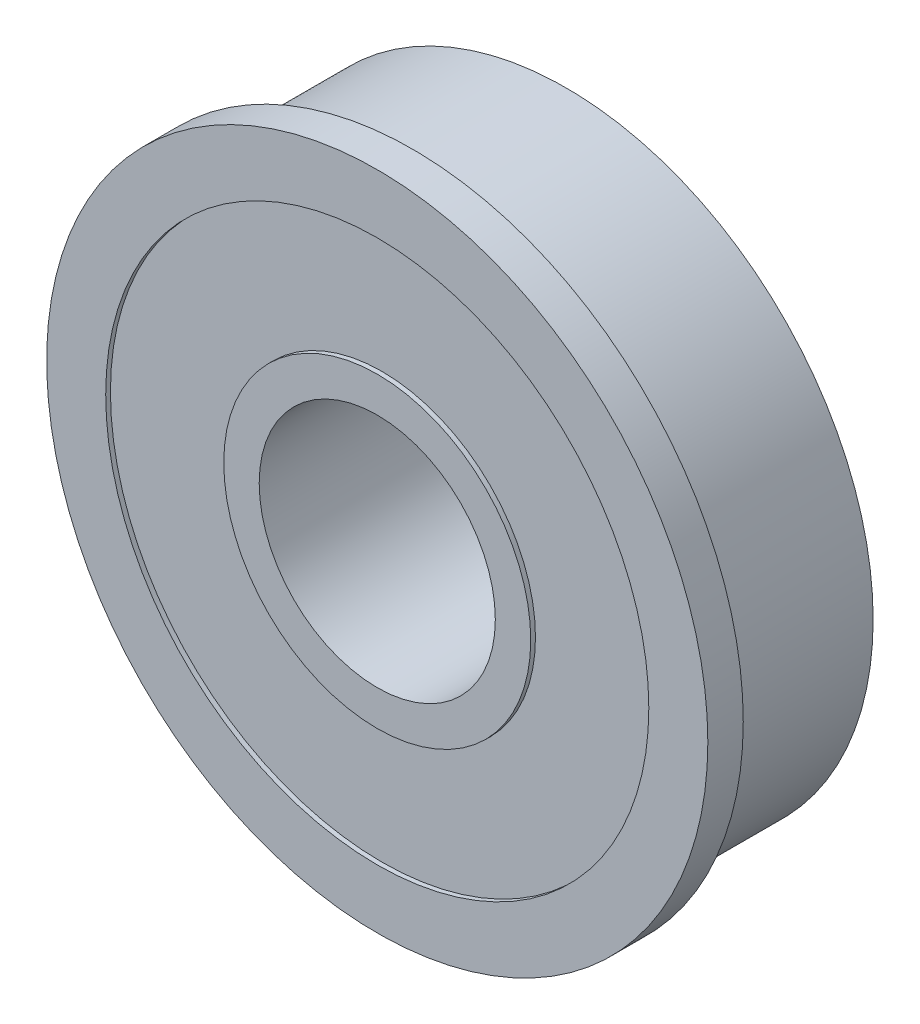
ISO-10303-21;
HEADER;
FILE_DESCRIPTION(('STEP AP214'),'2;1');
FILE_NAME('part.step','',(''),(''),'','','');
FILE_SCHEMA(('AUTOMOTIVE_DESIGN { 1 0 10303 214 1 1 1 1 }'));
ENDSEC;
DATA;
#1=APPLICATION_CONTEXT('core data for automotive mechanical design processes');
#2=APPLICATION_PROTOCOL_DEFINITION('international standard','automotive_design',2000,#1);
#3=PRODUCT_CONTEXT('',#1,'mechanical');
#4=PRODUCT('Part','Part','',(#3));
#5=PRODUCT_RELATED_PRODUCT_CATEGORY('part','',(#4));
#6=PRODUCT_DEFINITION_FORMATION('','',#4);
#7=PRODUCT_DEFINITION_CONTEXT('part definition',#1,'design');
#8=PRODUCT_DEFINITION('design','',#6,#7);
#9=PRODUCT_DEFINITION_SHAPE('','',#8);
#10=(LENGTH_UNIT() NAMED_UNIT(*) SI_UNIT(.MILLI.,.METRE.));
#11=(NAMED_UNIT(*) PLANE_ANGLE_UNIT() SI_UNIT($,.RADIAN.));
#12=(NAMED_UNIT(*) SI_UNIT($,.STERADIAN.) SOLID_ANGLE_UNIT());
#13=UNCERTAINTY_MEASURE_WITH_UNIT(LENGTH_MEASURE(1.E-05),#10,'distance_accuracy_value','');
#14=(GEOMETRIC_REPRESENTATION_CONTEXT(3) GLOBAL_UNCERTAINTY_ASSIGNED_CONTEXT((#13)) GLOBAL_UNIT_ASSIGNED_CONTEXT((#10,
#11,#12)) REPRESENTATION_CONTEXT('',''));
#15=CARTESIAN_POINT('',(0.,0.,0.));
#16=DIRECTION('',(0.,0.,1.));
#17=DIRECTION('',(1.,0.,0.));
#18=AXIS2_PLACEMENT_3D('',#15,#16,#17);
#19=CARTESIAN_POINT('',(0.,0.,0.));
#20=DIRECTION('',(0.,0.,1.));
#21=DIRECTION('',(1.,0.,0.));
#22=AXIS2_PLACEMENT_3D('',#19,#20,#21);
#23=PLANE('',#22);
#24=CARTESIAN_POINT('',(0.,0.,0.));
#25=DIRECTION('',(0.,0.,-1.));
#26=DIRECTION('',(-1.,0.,0.));
#27=AXIS2_PLACEMENT_3D('',#24,#25,#26);
#28=CIRCLE('',#27,5.);
#29=CARTESIAN_POINT('',(-5.,0.,0.));
#30=VERTEX_POINT('',#29);
#31=EDGE_CURVE('E64',#30,#30,#28,.F.);
#32=ORIENTED_EDGE('',*,*,#31,.T.);
#33=EDGE_LOOP('',(#32));
#34=FACE_BOUND('',#33,.T.);
#35=CARTESIAN_POINT('',(0.,0.,0.));
#36=DIRECTION('',(0.,0.,-1.));
#37=DIRECTION('',(-1.,0.,0.));
#38=AXIS2_PLACEMENT_3D('',#35,#36,#37);
#39=CIRCLE('',#38,6.5);
#40=CARTESIAN_POINT('',(-6.5,0.,0.));
#41=VERTEX_POINT('',#40);
#42=EDGE_CURVE('E101',#41,#41,#39,.T.);
#43=ORIENTED_EDGE('',*,*,#42,.T.);
#44=EDGE_LOOP('',(#43));
#45=FACE_BOUND('',#44,.T.);
#46=ADVANCED_FACE('F40',(#34,#45),#23,.F.);
#47=CARTESIAN_POINT('',(0.,0.,8.));
#48=DIRECTION('',(0.,0.,1.));
#49=DIRECTION('',(1.,0.,0.));
#50=AXIS2_PLACEMENT_3D('',#47,#48,#49);
#51=PLANE('',#50);
#52=CARTESIAN_POINT('',(0.,0.,8.));
#53=DIRECTION('',(0.,0.,-1.));
#54=DIRECTION('',(-1.,0.,0.));
#55=AXIS2_PLACEMENT_3D('',#52,#53,#54);
#56=CIRCLE('',#55,5.);
#57=CARTESIAN_POINT('',(-5.,0.,8.));
#58=VERTEX_POINT('',#57);
#59=EDGE_CURVE('E49',#58,#58,#56,.T.);
#60=ORIENTED_EDGE('',*,*,#59,.T.);
#61=EDGE_LOOP('',(#60));
#62=FACE_BOUND('',#61,.T.);
#63=CARTESIAN_POINT('',(0.,0.,8.));
#64=DIRECTION('',(0.,0.,1.));
#65=DIRECTION('',(1.,0.,0.));
#66=AXIS2_PLACEMENT_3D('',#63,#64,#65);
#67=CIRCLE('',#66,6.5);
#68=CARTESIAN_POINT('',(6.5,0.,8.));
#69=VERTEX_POINT('',#68);
#70=EDGE_CURVE('E85',#69,#69,#67,.T.);
#71=ORIENTED_EDGE('',*,*,#70,.T.);
#72=EDGE_LOOP('',(#71));
#73=FACE_BOUND('',#72,.T.);
#74=ADVANCED_FACE('F138',(#62,#73),#51,.T.);
#75=CARTESIAN_POINT('',(0.,0.,8.));
#76=DIRECTION('',(0.,0.,-1.));
#77=DIRECTION('',(-1.,0.,0.));
#78=AXIS2_PLACEMENT_3D('',#75,#76,#77);
#79=CYLINDRICAL_SURFACE('',#78,13.);
#80=CARTESIAN_POINT('',(0.,0.,6.5));
#81=DIRECTION('',(0.,0.,-1.));
#82=DIRECTION('',(-1.,0.,0.));
#83=AXIS2_PLACEMENT_3D('',#80,#81,#82);
#84=CIRCLE('',#83,13.);
#85=CARTESIAN_POINT('',(-13.,0.,6.5));
#86=VERTEX_POINT('',#85);
#87=EDGE_CURVE('E67',#86,#86,#84,.T.);
#88=ORIENTED_EDGE('',*,*,#87,.T.);
#89=EDGE_LOOP('',(#88));
#90=FACE_BOUND('',#89,.T.);
#91=CARTESIAN_POINT('',(0.,0.,0.));
#92=DIRECTION('',(0.,0.,-1.));
#93=DIRECTION('',(-1.,0.,0.));
#94=AXIS2_PLACEMENT_3D('',#91,#92,#93);
#95=CIRCLE('',#94,13.);
#96=CARTESIAN_POINT('',(-13.,0.,0.));
#97=VERTEX_POINT('',#96);
#98=EDGE_CURVE('E44',#97,#97,#95,.F.);
#99=ORIENTED_EDGE('',*,*,#98,.T.);
#100=EDGE_LOOP('',(#99));
#101=FACE_BOUND('',#100,.T.);
#102=ADVANCED_FACE('F42',(#90,#101),#79,.T.);
#103=CARTESIAN_POINT('',(0.,0.120654378241259,0.));
#104=DIRECTION('',(0.,0.,-1.));
#105=DIRECTION('',(-1.,0.,0.));
#106=AXIS2_PLACEMENT_3D('',#103,#104,#105);
#107=CIRCLE('',#106,11.5);
#108=CARTESIAN_POINT('',(-11.5,0.120654378241259,0.));
#109=VERTEX_POINT('',#108);
#110=EDGE_CURVE('E93',#109,#109,#107,.T.);
#111=ORIENTED_EDGE('',*,*,#110,.F.);
#112=EDGE_LOOP('',(#111));
#113=FACE_BOUND('',#112,.T.);
#114=ORIENTED_EDGE('',*,*,#98,.F.);
#115=EDGE_LOOP('',(#114));
#116=FACE_BOUND('',#115,.T.);
#117=ADVANCED_FACE('F125',(#113,#116),#23,.F.);
#118=CARTESIAN_POINT('',(0.,0.,6.5));
#119=DIRECTION('',(0.,0.,1.));
#120=DIRECTION('',(1.,0.,0.));
#121=AXIS2_PLACEMENT_3D('',#118,#119,#120);
#122=PLANE('',#121);
#123=ORIENTED_EDGE('',*,*,#87,.F.);
#124=EDGE_LOOP('',(#123));
#125=FACE_BOUND('',#124,.T.);
#126=CARTESIAN_POINT('',(0.,0.,6.5));
#127=DIRECTION('',(0.,0.,1.));
#128=DIRECTION('',(1.,0.,0.));
#129=AXIS2_PLACEMENT_3D('',#126,#127,#128);
#130=CIRCLE('',#129,14.);
#131=CARTESIAN_POINT('',(14.,0.,6.5));
#132=VERTEX_POINT('',#131);
#133=EDGE_CURVE('E55',#132,#132,#130,.T.);
#134=ORIENTED_EDGE('',*,*,#133,.F.);
#135=EDGE_LOOP('',(#134));
#136=FACE_BOUND('',#135,.T.);
#137=ADVANCED_FACE('F128',(#125,#136),#122,.F.);
#138=CARTESIAN_POINT('',(0.,0.,8.));
#139=DIRECTION('',(0.,0.,-1.));
#140=DIRECTION('',(-1.,0.,0.));
#141=AXIS2_PLACEMENT_3D('',#138,#139,#140);
#142=CYLINDRICAL_SURFACE('',#141,5.);
#143=ORIENTED_EDGE('',*,*,#59,.F.);
#144=EDGE_LOOP('',(#143));
#145=FACE_BOUND('',#144,.T.);
#146=ORIENTED_EDGE('',*,*,#31,.F.);
#147=EDGE_LOOP('',(#146));
#148=FACE_BOUND('',#147,.T.);
#149=ADVANCED_FACE('F134',(#145,#148),#142,.F.);
#150=CARTESIAN_POINT('',(0.,0.,6.5));
#151=DIRECTION('',(0.,0.,1.));
#152=DIRECTION('',(1.,0.,0.));
#153=AXIS2_PLACEMENT_3D('',#150,#151,#152);
#154=CYLINDRICAL_SURFACE('',#153,14.);
#155=ORIENTED_EDGE('',*,*,#133,.T.);
#156=EDGE_LOOP('',(#155));
#157=FACE_BOUND('',#156,.T.);
#158=CARTESIAN_POINT('',(0.,0.,8.));
#159=DIRECTION('',(0.,0.,1.));
#160=DIRECTION('',(1.,0.,0.));
#161=AXIS2_PLACEMENT_3D('',#158,#159,#160);
#162=CIRCLE('',#161,14.);
#163=CARTESIAN_POINT('',(14.,0.,8.));
#164=VERTEX_POINT('',#163);
#165=EDGE_CURVE('E10',#164,#164,#162,.T.);
#166=ORIENTED_EDGE('',*,*,#165,.F.);
#167=EDGE_LOOP('',(#166));
#168=FACE_BOUND('',#167,.T.);
#169=ADVANCED_FACE('F167',(#157,#168),#154,.T.);
#170=CARTESIAN_POINT('',(0.,0.,8.));
#171=DIRECTION('',(0.,0.,1.));
#172=DIRECTION('',(1.,0.,0.));
#173=AXIS2_PLACEMENT_3D('',#170,#171,#172);
#174=CIRCLE('',#173,11.5);
#175=CARTESIAN_POINT('',(11.5,0.,8.));
#176=VERTEX_POINT('',#175);
#177=EDGE_CURVE('E58',#176,#176,#174,.T.);
#178=ORIENTED_EDGE('',*,*,#177,.F.);
#179=EDGE_LOOP('',(#178));
#180=FACE_BOUND('',#179,.T.);
#181=ORIENTED_EDGE('',*,*,#165,.T.);
#182=EDGE_LOOP('',(#181));
#183=FACE_BOUND('',#182,.T.);
#184=ADVANCED_FACE('F147',(#180,#183),#51,.T.);
#185=CARTESIAN_POINT('',(0.,0.,7.8));
#186=DIRECTION('',(0.,0.,1.));
#187=DIRECTION('',(1.,0.,0.));
#188=AXIS2_PLACEMENT_3D('',#185,#186,#187);
#189=CYLINDRICAL_SURFACE('',#188,11.5);
#190=CARTESIAN_POINT('',(0.,0.,7.8));
#191=DIRECTION('',(0.,0.,1.));
#192=DIRECTION('',(1.,0.,0.));
#193=AXIS2_PLACEMENT_3D('',#190,#191,#192);
#194=CIRCLE('',#193,11.5);
#195=CARTESIAN_POINT('',(11.5,0.,7.8));
#196=VERTEX_POINT('',#195);
#197=EDGE_CURVE('E74',#196,#196,#194,.T.);
#198=ORIENTED_EDGE('',*,*,#197,.F.);
#199=EDGE_LOOP('',(#198));
#200=FACE_BOUND('',#199,.T.);
#201=ORIENTED_EDGE('',*,*,#177,.T.);
#202=EDGE_LOOP('',(#201));
#203=FACE_BOUND('',#202,.T.);
#204=ADVANCED_FACE('F139',(#200,#203),#189,.F.);
#205=CARTESIAN_POINT('',(0.,0.,7.8));
#206=DIRECTION('',(0.,0.,1.));
#207=DIRECTION('',(1.,0.,0.));
#208=AXIS2_PLACEMENT_3D('',#205,#206,#207);
#209=PLANE('',#208);
#210=CARTESIAN_POINT('',(0.,0.,7.8));
#211=DIRECTION('',(0.,0.,1.));
#212=DIRECTION('',(1.,0.,0.));
#213=AXIS2_PLACEMENT_3D('',#210,#211,#212);
#214=CIRCLE('',#213,6.5);
#215=CARTESIAN_POINT('',(6.5,0.,7.8));
#216=VERTEX_POINT('',#215);
#217=EDGE_CURVE('E83',#216,#216,#214,.T.);
#218=ORIENTED_EDGE('',*,*,#217,.F.);
#219=EDGE_LOOP('',(#218));
#220=FACE_BOUND('',#219,.T.);
#221=ORIENTED_EDGE('',*,*,#197,.T.);
#222=EDGE_LOOP('',(#221));
#223=FACE_BOUND('',#222,.T.);
#224=ADVANCED_FACE('F158',(#220,#223),#209,.T.);
#225=CARTESIAN_POINT('',(0.,0.,7.8));
#226=DIRECTION('',(0.,0.,1.));
#227=DIRECTION('',(1.,0.,0.));
#228=AXIS2_PLACEMENT_3D('',#225,#226,#227);
#229=CYLINDRICAL_SURFACE('',#228,6.5);
#230=ORIENTED_EDGE('',*,*,#217,.T.);
#231=EDGE_LOOP('',(#230));
#232=FACE_BOUND('',#231,.T.);
#233=ORIENTED_EDGE('',*,*,#70,.F.);
#234=EDGE_LOOP('',(#233));
#235=FACE_BOUND('',#234,.T.);
#236=ADVANCED_FACE('F121',(#232,#235),#229,.T.);
#237=CARTESIAN_POINT('',(0.,0.120654378241259,0.2));
#238=DIRECTION('',(0.,0.,-1.));
#239=DIRECTION('',(-1.,0.,0.));
#240=AXIS2_PLACEMENT_3D('',#237,#238,#239);
#241=CYLINDRICAL_SURFACE('',#240,11.5);
#242=CARTESIAN_POINT('',(0.,0.120654378241259,0.2));
#243=DIRECTION('',(0.,0.,-1.));
#244=DIRECTION('',(-1.,0.,0.));
#245=AXIS2_PLACEMENT_3D('',#242,#243,#244);
#246=CIRCLE('',#245,11.5);
#247=CARTESIAN_POINT('',(-11.5,0.120654378241259,0.2));
#248=VERTEX_POINT('',#247);
#249=EDGE_CURVE('E89',#248,#248,#246,.T.);
#250=ORIENTED_EDGE('',*,*,#249,.F.);
#251=EDGE_LOOP('',(#250));
#252=FACE_BOUND('',#251,.T.);
#253=ORIENTED_EDGE('',*,*,#110,.T.);
#254=EDGE_LOOP('',(#253));
#255=FACE_BOUND('',#254,.T.);
#256=ADVANCED_FACE('F115',(#252,#255),#241,.F.);
#257=CARTESIAN_POINT('',(0.,0.120654378241259,0.2));
#258=DIRECTION('',(0.,0.,-1.));
#259=DIRECTION('',(-1.,0.,0.));
#260=AXIS2_PLACEMENT_3D('',#257,#258,#259);
#261=PLANE('',#260);
#262=CARTESIAN_POINT('',(0.,0.,0.2));
#263=DIRECTION('',(0.,0.,-1.));
#264=DIRECTION('',(-1.,0.,0.));
#265=AXIS2_PLACEMENT_3D('',#262,#263,#264);
#266=CIRCLE('',#265,6.5);
#267=CARTESIAN_POINT('',(-6.5,0.,0.2));
#268=VERTEX_POINT('',#267);
#269=EDGE_CURVE('E97',#268,#268,#266,.T.);
#270=ORIENTED_EDGE('',*,*,#269,.F.);
#271=EDGE_LOOP('',(#270));
#272=FACE_BOUND('',#271,.T.);
#273=ORIENTED_EDGE('',*,*,#249,.T.);
#274=EDGE_LOOP('',(#273));
#275=FACE_BOUND('',#274,.T.);
#276=ADVANCED_FACE('F112',(#272,#275),#261,.T.);
#277=CARTESIAN_POINT('',(0.,0.,0.2));
#278=DIRECTION('',(0.,0.,-1.));
#279=DIRECTION('',(-1.,0.,0.));
#280=AXIS2_PLACEMENT_3D('',#277,#278,#279);
#281=CYLINDRICAL_SURFACE('',#280,6.5);
#282=ORIENTED_EDGE('',*,*,#269,.T.);
#283=EDGE_LOOP('',(#282));
#284=FACE_BOUND('',#283,.T.);
#285=ORIENTED_EDGE('',*,*,#42,.F.);
#286=EDGE_LOOP('',(#285));
#287=FACE_BOUND('',#286,.T.);
#288=ADVANCED_FACE('F109',(#284,#287),#281,.T.);
#289=CLOSED_SHELL('',(#46,#74,#102,#117,#137,#149,#169,#184,#204,#224,#236,#256,#276,#288));
#290=MANIFOLD_SOLID_BREP('B2',#289);
#291=ADVANCED_BREP_SHAPE_REPRESENTATION('',(#18,#290),#14);
#292=SHAPE_DEFINITION_REPRESENTATION(#9,#291);
ENDSEC;
END-ISO-10303-21;
